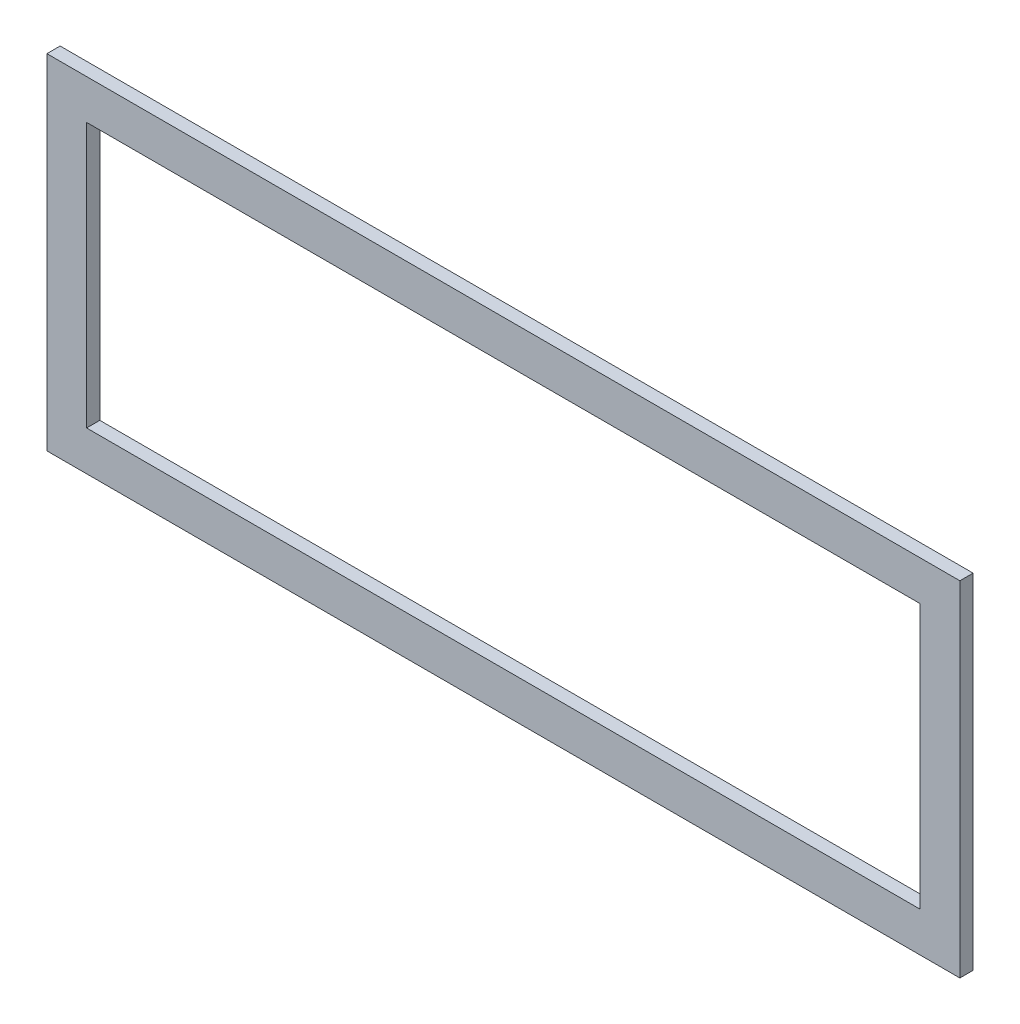
ISO-10303-21;
HEADER;
FILE_DESCRIPTION(('STEP AP214'),'2;1');
FILE_NAME('part.step','',(''),(''),'','','');
FILE_SCHEMA(('AUTOMOTIVE_DESIGN { 1 0 10303 214 1 1 1 1 }'));
ENDSEC;
DATA;
#1=APPLICATION_CONTEXT('core data for automotive mechanical design processes');
#2=APPLICATION_PROTOCOL_DEFINITION('international standard','automotive_design',2000,#1);
#3=PRODUCT_CONTEXT('',#1,'mechanical');
#4=PRODUCT('Part','Part','',(#3));
#5=PRODUCT_RELATED_PRODUCT_CATEGORY('part','',(#4));
#6=PRODUCT_DEFINITION_FORMATION('','',#4);
#7=PRODUCT_DEFINITION_CONTEXT('part definition',#1,'design');
#8=PRODUCT_DEFINITION('design','',#6,#7);
#9=PRODUCT_DEFINITION_SHAPE('','',#8);
#10=(LENGTH_UNIT() NAMED_UNIT(*) SI_UNIT(.MILLI.,.METRE.));
#11=(NAMED_UNIT(*) PLANE_ANGLE_UNIT() SI_UNIT($,.RADIAN.));
#12=(NAMED_UNIT(*) SI_UNIT($,.STERADIAN.) SOLID_ANGLE_UNIT());
#13=UNCERTAINTY_MEASURE_WITH_UNIT(LENGTH_MEASURE(1.E-05),#10,'distance_accuracy_value','');
#14=(GEOMETRIC_REPRESENTATION_CONTEXT(3) GLOBAL_UNCERTAINTY_ASSIGNED_CONTEXT((#13)) GLOBAL_UNIT_ASSIGNED_CONTEXT((#10,
#11,#12)) REPRESENTATION_CONTEXT('',''));
#15=CARTESIAN_POINT('',(0.,0.,0.));
#16=DIRECTION('',(0.,0.,1.));
#17=DIRECTION('',(1.,0.,0.));
#18=AXIS2_PLACEMENT_3D('',#15,#16,#17);
#19=CARTESIAN_POINT('',(0.,0.,2.));
#20=DIRECTION('',(0.,0.,-1.));
#21=DIRECTION('',(-1.,0.,0.));
#22=AXIS2_PLACEMENT_3D('',#19,#20,#21);
#23=PLANE('',#22);
#24=DIRECTION('',(0.,-1.,0.));
#25=VECTOR('',#24,1.);
#26=CARTESIAN_POINT('',(0.,0.,2.));
#27=LINE('',#26,#25);
#28=CARTESIAN_POINT('',(0.,52.,2.));
#29=VERTEX_POINT('',#28);
#30=CARTESIAN_POINT('',(0.,0.,2.));
#31=VERTEX_POINT('',#30);
#32=EDGE_CURVE('E143',#29,#31,#27,.T.);
#33=ORIENTED_EDGE('',*,*,#32,.T.);
#34=DIRECTION('',(1.,0.,0.));
#35=VECTOR('',#34,1.);
#36=CARTESIAN_POINT('',(0.,0.,2.));
#37=LINE('',#36,#35);
#38=CARTESIAN_POINT('',(138.,0.,2.));
#39=VERTEX_POINT('',#38);
#40=EDGE_CURVE('E150',#31,#39,#37,.T.);
#41=ORIENTED_EDGE('',*,*,#40,.T.);
#42=DIRECTION('',(0.,1.,0.));
#43=VECTOR('',#42,1.);
#44=CARTESIAN_POINT('',(138.,0.,2.));
#45=LINE('',#44,#43);
#46=CARTESIAN_POINT('',(138.,52.,2.));
#47=VERTEX_POINT('',#46);
#48=EDGE_CURVE('E148',#39,#47,#45,.T.);
#49=ORIENTED_EDGE('',*,*,#48,.T.);
#50=DIRECTION('',(-1.,0.,0.));
#51=VECTOR('',#50,1.);
#52=CARTESIAN_POINT('',(0.,52.,2.));
#53=LINE('',#52,#51);
#54=EDGE_CURVE('E155',#47,#29,#53,.T.);
#55=ORIENTED_EDGE('',*,*,#54,.T.);
#56=EDGE_LOOP('',(#33,#41,#49,#55));
#57=FACE_BOUND('',#56,.T.);
#58=DIRECTION('',(0.,-1.,0.));
#59=VECTOR('',#58,1.);
#60=CARTESIAN_POINT('',(6.,6.,2.));
#61=LINE('',#60,#59);
#62=CARTESIAN_POINT('',(6.,46.,2.));
#63=VERTEX_POINT('',#62);
#64=CARTESIAN_POINT('',(6.,6.,2.));
#65=VERTEX_POINT('',#64);
#66=EDGE_CURVE('E106',#63,#65,#61,.T.);
#67=ORIENTED_EDGE('',*,*,#66,.F.);
#68=DIRECTION('',(-1.,0.,0.));
#69=VECTOR('',#68,1.);
#70=CARTESIAN_POINT('',(6.,46.,2.));
#71=LINE('',#70,#69);
#72=CARTESIAN_POINT('',(132.,46.,2.));
#73=VERTEX_POINT('',#72);
#74=EDGE_CURVE('E127',#73,#63,#71,.T.);
#75=ORIENTED_EDGE('',*,*,#74,.F.);
#76=DIRECTION('',(0.,1.,0.));
#77=VECTOR('',#76,1.);
#78=CARTESIAN_POINT('',(132.,6.,2.));
#79=LINE('',#78,#77);
#80=CARTESIAN_POINT('',(132.,6.,2.));
#81=VERTEX_POINT('',#80);
#82=EDGE_CURVE('E126',#81,#73,#79,.T.);
#83=ORIENTED_EDGE('',*,*,#82,.F.);
#84=DIRECTION('',(1.,0.,0.));
#85=VECTOR('',#84,1.);
#86=CARTESIAN_POINT('',(6.,6.,2.));
#87=LINE('',#86,#85);
#88=EDGE_CURVE('E118',#65,#81,#87,.T.);
#89=ORIENTED_EDGE('',*,*,#88,.F.);
#90=EDGE_LOOP('',(#67,#75,#83,#89));
#91=FACE_BOUND('',#90,.T.);
#92=ADVANCED_FACE('F43',(#57,#91),#23,.F.);
#93=CARTESIAN_POINT('',(0.,0.,0.));
#94=DIRECTION('',(0.,0.,-1.));
#95=DIRECTION('',(-1.,0.,0.));
#96=AXIS2_PLACEMENT_3D('',#93,#94,#95);
#97=PLANE('',#96);
#98=DIRECTION('',(0.,-1.,0.));
#99=VECTOR('',#98,1.);
#100=CARTESIAN_POINT('',(0.,0.,0.));
#101=LINE('',#100,#99);
#102=CARTESIAN_POINT('',(0.,52.,0.));
#103=VERTEX_POINT('',#102);
#104=CARTESIAN_POINT('',(0.,0.,0.));
#105=VERTEX_POINT('',#104);
#106=EDGE_CURVE('E125',#103,#105,#101,.T.);
#107=ORIENTED_EDGE('',*,*,#106,.F.);
#108=DIRECTION('',(-1.,0.,0.));
#109=VECTOR('',#108,1.);
#110=CARTESIAN_POINT('',(0.,52.,0.));
#111=LINE('',#110,#109);
#112=CARTESIAN_POINT('',(138.,52.,0.));
#113=VERTEX_POINT('',#112);
#114=EDGE_CURVE('E149',#113,#103,#111,.T.);
#115=ORIENTED_EDGE('',*,*,#114,.F.);
#116=DIRECTION('',(0.,1.,0.));
#117=VECTOR('',#116,1.);
#118=CARTESIAN_POINT('',(138.,0.,0.));
#119=LINE('',#118,#117);
#120=CARTESIAN_POINT('',(138.,0.,0.));
#121=VERTEX_POINT('',#120);
#122=EDGE_CURVE('E159',#121,#113,#119,.T.);
#123=ORIENTED_EDGE('',*,*,#122,.F.);
#124=DIRECTION('',(1.,0.,0.));
#125=VECTOR('',#124,1.);
#126=CARTESIAN_POINT('',(0.,0.,0.));
#127=LINE('',#126,#125);
#128=EDGE_CURVE('E160',#105,#121,#127,.T.);
#129=ORIENTED_EDGE('',*,*,#128,.F.);
#130=EDGE_LOOP('',(#107,#115,#123,#129));
#131=FACE_BOUND('',#130,.T.);
#132=DIRECTION('',(-1.,0.,0.));
#133=VECTOR('',#132,1.);
#134=CARTESIAN_POINT('',(6.,46.,0.));
#135=LINE('',#134,#133);
#136=CARTESIAN_POINT('',(132.,46.,0.));
#137=VERTEX_POINT('',#136);
#138=CARTESIAN_POINT('',(6.,46.,0.));
#139=VERTEX_POINT('',#138);
#140=EDGE_CURVE('E120',#137,#139,#135,.T.);
#141=ORIENTED_EDGE('',*,*,#140,.T.);
#142=DIRECTION('',(0.,-1.,0.));
#143=VECTOR('',#142,1.);
#144=CARTESIAN_POINT('',(6.,6.,0.));
#145=LINE('',#144,#143);
#146=CARTESIAN_POINT('',(6.,6.,0.));
#147=VERTEX_POINT('',#146);
#148=EDGE_CURVE('E67',#139,#147,#145,.T.);
#149=ORIENTED_EDGE('',*,*,#148,.T.);
#150=DIRECTION('',(1.,0.,0.));
#151=VECTOR('',#150,1.);
#152=CARTESIAN_POINT('',(6.,6.,0.));
#153=LINE('',#152,#151);
#154=CARTESIAN_POINT('',(132.,6.,0.));
#155=VERTEX_POINT('',#154);
#156=EDGE_CURVE('E121',#147,#155,#153,.T.);
#157=ORIENTED_EDGE('',*,*,#156,.T.);
#158=DIRECTION('',(0.,1.,0.));
#159=VECTOR('',#158,1.);
#160=CARTESIAN_POINT('',(132.,6.,0.));
#161=LINE('',#160,#159);
#162=EDGE_CURVE('E136',#155,#137,#161,.T.);
#163=ORIENTED_EDGE('',*,*,#162,.T.);
#164=EDGE_LOOP('',(#141,#149,#157,#163));
#165=FACE_BOUND('',#164,.T.);
#166=ADVANCED_FACE('F180',(#131,#165),#97,.T.);
#167=CARTESIAN_POINT('',(0.,0.,2.));
#168=DIRECTION('',(1.,0.,0.));
#169=DIRECTION('',(0.,0.,-1.));
#170=AXIS2_PLACEMENT_3D('',#167,#168,#169);
#171=PLANE('',#170);
#172=ORIENTED_EDGE('',*,*,#106,.T.);
#173=DIRECTION('',(0.,0.,-1.));
#174=VECTOR('',#173,1.);
#175=CARTESIAN_POINT('',(0.,0.,2.));
#176=LINE('',#175,#174);
#177=EDGE_CURVE('E11',#31,#105,#176,.T.);
#178=ORIENTED_EDGE('',*,*,#177,.F.);
#179=ORIENTED_EDGE('',*,*,#32,.F.);
#180=DIRECTION('',(0.,0.,-1.));
#181=VECTOR('',#180,1.);
#182=CARTESIAN_POINT('',(0.,52.,2.));
#183=LINE('',#182,#181);
#184=EDGE_CURVE('E152',#29,#103,#183,.T.);
#185=ORIENTED_EDGE('',*,*,#184,.T.);
#186=EDGE_LOOP('',(#172,#178,#179,#185));
#187=FACE_BOUND('',#186,.T.);
#188=ADVANCED_FACE('F44',(#187),#171,.F.);
#189=CARTESIAN_POINT('',(0.,0.,2.));
#190=DIRECTION('',(0.,1.,0.));
#191=DIRECTION('',(0.,0.,1.));
#192=AXIS2_PLACEMENT_3D('',#189,#190,#191);
#193=PLANE('',#192);
#194=ORIENTED_EDGE('',*,*,#128,.T.);
#195=DIRECTION('',(0.,0.,-1.));
#196=VECTOR('',#195,1.);
#197=CARTESIAN_POINT('',(138.,0.,2.));
#198=LINE('',#197,#196);
#199=EDGE_CURVE('E51',#39,#121,#198,.T.);
#200=ORIENTED_EDGE('',*,*,#199,.F.);
#201=ORIENTED_EDGE('',*,*,#40,.F.);
#202=ORIENTED_EDGE('',*,*,#177,.T.);
#203=EDGE_LOOP('',(#194,#200,#201,#202));
#204=FACE_BOUND('',#203,.T.);
#205=ADVANCED_FACE('F190',(#204),#193,.F.);
#206=CARTESIAN_POINT('',(138.,0.,2.));
#207=DIRECTION('',(-1.,0.,0.));
#208=DIRECTION('',(0.,0.,1.));
#209=AXIS2_PLACEMENT_3D('',#206,#207,#208);
#210=PLANE('',#209);
#211=ORIENTED_EDGE('',*,*,#122,.T.);
#212=DIRECTION('',(0.,0.,-1.));
#213=VECTOR('',#212,1.);
#214=CARTESIAN_POINT('',(138.,52.,2.));
#215=LINE('',#214,#213);
#216=EDGE_CURVE('E162',#47,#113,#215,.T.);
#217=ORIENTED_EDGE('',*,*,#216,.F.);
#218=ORIENTED_EDGE('',*,*,#48,.F.);
#219=ORIENTED_EDGE('',*,*,#199,.T.);
#220=EDGE_LOOP('',(#211,#217,#218,#219));
#221=FACE_BOUND('',#220,.T.);
#222=ADVANCED_FACE('F173',(#221),#210,.F.);
#223=CARTESIAN_POINT('',(0.,52.,2.));
#224=DIRECTION('',(0.,-1.,0.));
#225=DIRECTION('',(0.,0.,-1.));
#226=AXIS2_PLACEMENT_3D('',#223,#224,#225);
#227=PLANE('',#226);
#228=ORIENTED_EDGE('',*,*,#114,.T.);
#229=ORIENTED_EDGE('',*,*,#184,.F.);
#230=ORIENTED_EDGE('',*,*,#54,.F.);
#231=ORIENTED_EDGE('',*,*,#216,.T.);
#232=EDGE_LOOP('',(#228,#229,#230,#231));
#233=FACE_BOUND('',#232,.T.);
#234=ADVANCED_FACE('F181',(#233),#227,.F.);
#235=CARTESIAN_POINT('',(6.,6.,2.));
#236=DIRECTION('',(1.,0.,0.));
#237=DIRECTION('',(0.,0.,-1.));
#238=AXIS2_PLACEMENT_3D('',#235,#236,#237);
#239=PLANE('',#238);
#240=ORIENTED_EDGE('',*,*,#148,.F.);
#241=DIRECTION('',(0.,0.,-1.));
#242=VECTOR('',#241,1.);
#243=CARTESIAN_POINT('',(6.,46.,2.));
#244=LINE('',#243,#242);
#245=EDGE_CURVE('E115',#63,#139,#244,.T.);
#246=ORIENTED_EDGE('',*,*,#245,.F.);
#247=ORIENTED_EDGE('',*,*,#66,.T.);
#248=DIRECTION('',(0.,0.,-1.));
#249=VECTOR('',#248,1.);
#250=CARTESIAN_POINT('',(6.,6.,2.));
#251=LINE('',#250,#249);
#252=EDGE_CURVE('E112',#65,#147,#251,.T.);
#253=ORIENTED_EDGE('',*,*,#252,.T.);
#254=EDGE_LOOP('',(#240,#246,#247,#253));
#255=FACE_BOUND('',#254,.T.);
#256=ADVANCED_FACE('F109',(#255),#239,.T.);
#257=CARTESIAN_POINT('',(6.,6.,2.));
#258=DIRECTION('',(0.,1.,0.));
#259=DIRECTION('',(0.,0.,1.));
#260=AXIS2_PLACEMENT_3D('',#257,#258,#259);
#261=PLANE('',#260);
#262=ORIENTED_EDGE('',*,*,#156,.F.);
#263=ORIENTED_EDGE('',*,*,#252,.F.);
#264=ORIENTED_EDGE('',*,*,#88,.T.);
#265=DIRECTION('',(0.,0.,-1.));
#266=VECTOR('',#265,1.);
#267=CARTESIAN_POINT('',(132.,6.,2.));
#268=LINE('',#267,#266);
#269=EDGE_CURVE('E124',#81,#155,#268,.T.);
#270=ORIENTED_EDGE('',*,*,#269,.T.);
#271=EDGE_LOOP('',(#262,#263,#264,#270));
#272=FACE_BOUND('',#271,.T.);
#273=ADVANCED_FACE('F119',(#272),#261,.T.);
#274=CARTESIAN_POINT('',(132.,6.,2.));
#275=DIRECTION('',(-1.,0.,0.));
#276=DIRECTION('',(0.,0.,1.));
#277=AXIS2_PLACEMENT_3D('',#274,#275,#276);
#278=PLANE('',#277);
#279=ORIENTED_EDGE('',*,*,#162,.F.);
#280=ORIENTED_EDGE('',*,*,#269,.F.);
#281=ORIENTED_EDGE('',*,*,#82,.T.);
#282=DIRECTION('',(0.,0.,-1.));
#283=VECTOR('',#282,1.);
#284=CARTESIAN_POINT('',(132.,46.,2.));
#285=LINE('',#284,#283);
#286=EDGE_CURVE('E59',#73,#137,#285,.T.);
#287=ORIENTED_EDGE('',*,*,#286,.T.);
#288=EDGE_LOOP('',(#279,#280,#281,#287));
#289=FACE_BOUND('',#288,.T.);
#290=ADVANCED_FACE('F209',(#289),#278,.T.);
#291=CARTESIAN_POINT('',(6.,46.,2.));
#292=DIRECTION('',(0.,-1.,0.));
#293=DIRECTION('',(0.,0.,-1.));
#294=AXIS2_PLACEMENT_3D('',#291,#292,#293);
#295=PLANE('',#294);
#296=ORIENTED_EDGE('',*,*,#140,.F.);
#297=ORIENTED_EDGE('',*,*,#286,.F.);
#298=ORIENTED_EDGE('',*,*,#74,.T.);
#299=ORIENTED_EDGE('',*,*,#245,.T.);
#300=EDGE_LOOP('',(#296,#297,#298,#299));
#301=FACE_BOUND('',#300,.T.);
#302=ADVANCED_FACE('F215',(#301),#295,.T.);
#303=CLOSED_SHELL('',(#92,#166,#188,#205,#222,#234,#256,#273,#290,#302));
#304=MANIFOLD_SOLID_BREP('B2',#303);
#305=ADVANCED_BREP_SHAPE_REPRESENTATION('',(#18,#304),#14);
#306=SHAPE_DEFINITION_REPRESENTATION(#9,#305);
ENDSEC;
END-ISO-10303-21;
